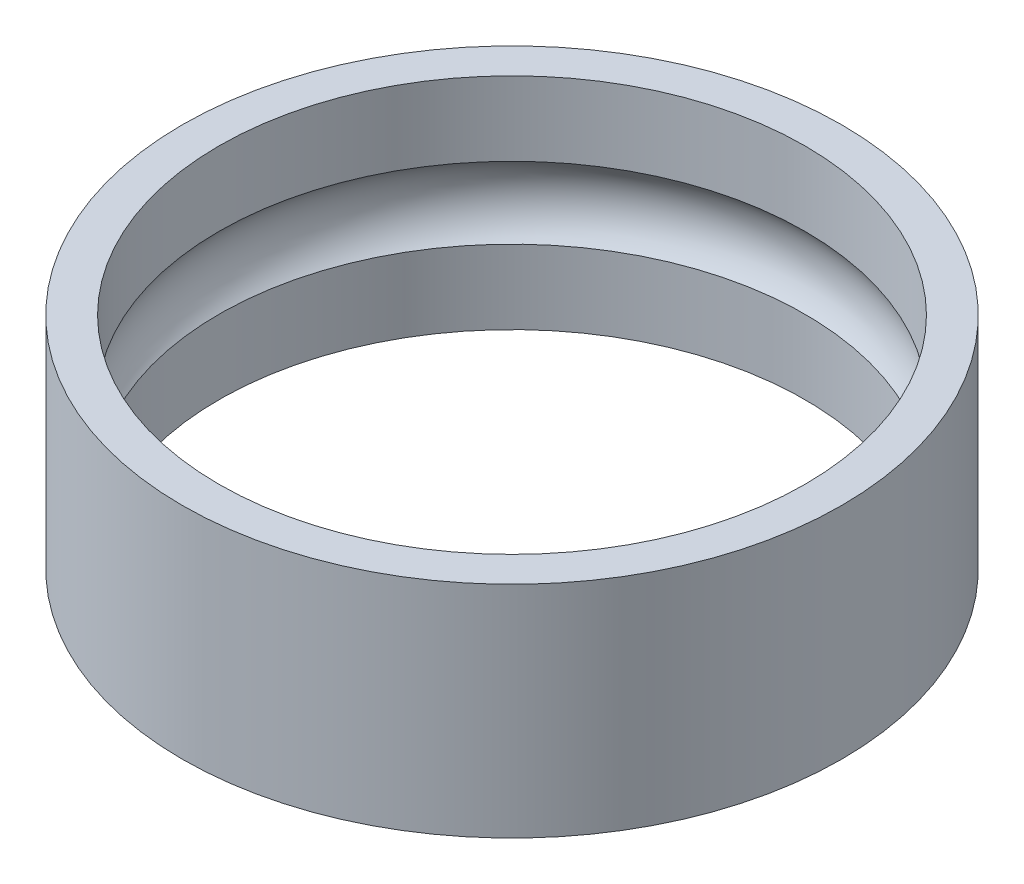
ISO-10303-21;
HEADER;
FILE_DESCRIPTION(('STEP AP214'),'2;1');
FILE_NAME('part.step','',(''),(''),'','','');
FILE_SCHEMA(('AUTOMOTIVE_DESIGN { 1 0 10303 214 1 1 1 1 }'));
ENDSEC;
DATA;
#1=APPLICATION_CONTEXT('core data for automotive mechanical design processes');
#2=APPLICATION_PROTOCOL_DEFINITION('international standard','automotive_design',2000,#1);
#3=PRODUCT_CONTEXT('',#1,'mechanical');
#4=PRODUCT('Part','Part','',(#3));
#5=PRODUCT_RELATED_PRODUCT_CATEGORY('part','',(#4));
#6=PRODUCT_DEFINITION_FORMATION('','',#4);
#7=PRODUCT_DEFINITION_CONTEXT('part definition',#1,'design');
#8=PRODUCT_DEFINITION('design','',#6,#7);
#9=PRODUCT_DEFINITION_SHAPE('','',#8);
#10=(LENGTH_UNIT() NAMED_UNIT(*) SI_UNIT(.MILLI.,.METRE.));
#11=(NAMED_UNIT(*) PLANE_ANGLE_UNIT() SI_UNIT($,.RADIAN.));
#12=(NAMED_UNIT(*) SI_UNIT($,.STERADIAN.) SOLID_ANGLE_UNIT());
#13=UNCERTAINTY_MEASURE_WITH_UNIT(LENGTH_MEASURE(1.E-05),#10,'distance_accuracy_value','');
#14=(GEOMETRIC_REPRESENTATION_CONTEXT(3) GLOBAL_UNCERTAINTY_ASSIGNED_CONTEXT((#13)) GLOBAL_UNIT_ASSIGNED_CONTEXT((#10,
#11,#12)) REPRESENTATION_CONTEXT('',''));
#15=CARTESIAN_POINT('',(0.,0.,0.));
#16=DIRECTION('',(0.,0.,1.));
#17=DIRECTION('',(1.,0.,0.));
#18=AXIS2_PLACEMENT_3D('',#15,#16,#17);
#19=CARTESIAN_POINT('',(0.,1.5,0.));
#20=DIRECTION('',(0.,-1.,0.));
#21=DIRECTION('',(0.,0.,-1.));
#22=AXIS2_PLACEMENT_3D('',#19,#20,#21);
#23=CYLINDRICAL_SURFACE('',#22,4.);
#24=CARTESIAN_POINT('',(0.,1.5,0.));
#25=DIRECTION('',(0.,1.,0.));
#26=DIRECTION('',(0.,0.,1.));
#27=AXIS2_PLACEMENT_3D('',#24,#25,#26);
#28=CIRCLE('',#27,4.);
#29=CARTESIAN_POINT('',(0.,1.5,4.));
#30=VERTEX_POINT('',#29);
#31=EDGE_CURVE('E45',#30,#30,#28,.T.);
#32=ORIENTED_EDGE('',*,*,#31,.T.);
#33=EDGE_LOOP('',(#32));
#34=FACE_BOUND('',#33,.T.);
#35=CARTESIAN_POINT('',(0.,0.489897948556634,0.));
#36=DIRECTION('',(0.,-1.,0.));
#37=DIRECTION('',(0.,0.,-1.));
#38=AXIS2_PLACEMENT_3D('',#35,#36,#37);
#39=CIRCLE('',#38,4.);
#40=CARTESIAN_POINT('',(0.,0.489897948556634,-4.));
#41=VERTEX_POINT('',#40);
#42=EDGE_CURVE('E36',#41,#41,#39,.T.);
#43=ORIENTED_EDGE('',*,*,#42,.T.);
#44=EDGE_LOOP('',(#43));
#45=FACE_BOUND('',#44,.T.);
#46=ADVANCED_FACE('F32',(#34,#45),#23,.F.);
#47=CARTESIAN_POINT('',(0.,-1.5,0.));
#48=DIRECTION('',(0.,1.,0.));
#49=DIRECTION('',(0.,0.,1.));
#50=AXIS2_PLACEMENT_3D('',#47,#48,#49);
#51=CIRCLE('',#50,4.);
#52=CARTESIAN_POINT('',(0.,-1.5,4.));
#53=VERTEX_POINT('',#52);
#54=EDGE_CURVE('E48',#53,#53,#51,.T.);
#55=ORIENTED_EDGE('',*,*,#54,.F.);
#56=EDGE_LOOP('',(#55));
#57=FACE_BOUND('',#56,.T.);
#58=CARTESIAN_POINT('',(0.,-0.489897948556634,0.));
#59=DIRECTION('',(0.,1.,0.));
#60=DIRECTION('',(0.,0.,1.));
#61=AXIS2_PLACEMENT_3D('',#58,#59,#60);
#62=CIRCLE('',#61,4.);
#63=CARTESIAN_POINT('',(0.,-0.489897948556634,4.));
#64=VERTEX_POINT('',#63);
#65=EDGE_CURVE('E50',#64,#64,#62,.T.);
#66=ORIENTED_EDGE('',*,*,#65,.T.);
#67=EDGE_LOOP('',(#66));
#68=FACE_BOUND('',#67,.T.);
#69=ADVANCED_FACE('F67',(#57,#68),#23,.F.);
#70=CARTESIAN_POINT('',(0.,1.5,0.));
#71=DIRECTION('',(0.,1.,0.));
#72=DIRECTION('',(0.,0.,1.));
#73=AXIS2_PLACEMENT_3D('',#70,#71,#72);
#74=PLANE('',#73);
#75=CARTESIAN_POINT('',(0.,1.5,0.));
#76=DIRECTION('',(0.,1.,0.));
#77=DIRECTION('',(0.,0.,1.));
#78=AXIS2_PLACEMENT_3D('',#75,#76,#77);
#79=CIRCLE('',#78,4.5);
#80=CARTESIAN_POINT('',(0.,1.5,4.5));
#81=VERTEX_POINT('',#80);
#82=EDGE_CURVE('E10',#81,#81,#79,.T.);
#83=ORIENTED_EDGE('',*,*,#82,.T.);
#84=EDGE_LOOP('',(#83));
#85=FACE_BOUND('',#84,.T.);
#86=ORIENTED_EDGE('',*,*,#31,.F.);
#87=EDGE_LOOP('',(#86));
#88=FACE_BOUND('',#87,.T.);
#89=ADVANCED_FACE('F64',(#85,#88),#74,.T.);
#90=CARTESIAN_POINT('',(0.,-1.5,0.));
#91=DIRECTION('',(0.,1.,0.));
#92=DIRECTION('',(0.,0.,1.));
#93=AXIS2_PLACEMENT_3D('',#90,#91,#92);
#94=PLANE('',#93);
#95=CARTESIAN_POINT('',(0.,-1.5,0.));
#96=DIRECTION('',(0.,1.,0.));
#97=DIRECTION('',(0.,0.,1.));
#98=AXIS2_PLACEMENT_3D('',#95,#96,#97);
#99=CIRCLE('',#98,4.5);
#100=CARTESIAN_POINT('',(0.,-1.5,4.5));
#101=VERTEX_POINT('',#100);
#102=EDGE_CURVE('E40',#101,#101,#99,.T.);
#103=ORIENTED_EDGE('',*,*,#102,.F.);
#104=EDGE_LOOP('',(#103));
#105=FACE_BOUND('',#104,.T.);
#106=ORIENTED_EDGE('',*,*,#54,.T.);
#107=EDGE_LOOP('',(#106));
#108=FACE_BOUND('',#107,.T.);
#109=ADVANCED_FACE('F66',(#105,#108),#94,.F.);
#110=CARTESIAN_POINT('',(0.,1.5,0.));
#111=DIRECTION('',(0.,-1.,0.));
#112=DIRECTION('',(0.,0.,-1.));
#113=AXIS2_PLACEMENT_3D('',#110,#111,#112);
#114=CYLINDRICAL_SURFACE('',#113,4.5);
#115=ORIENTED_EDGE('',*,*,#82,.F.);
#116=EDGE_LOOP('',(#115));
#117=FACE_BOUND('',#116,.T.);
#118=ORIENTED_EDGE('',*,*,#102,.T.);
#119=EDGE_LOOP('',(#118));
#120=FACE_BOUND('',#119,.T.);
#121=ADVANCED_FACE('F34',(#117,#120),#114,.T.);
#122=CARTESIAN_POINT('',(0.,0.,0.));
#123=DIRECTION('',(0.,1.,0.));
#124=DIRECTION('',(0.,0.,1.));
#125=AXIS2_PLACEMENT_3D('',#122,#123,#124);
#126=TOROIDAL_SURFACE('',#125,3.5,0.699999999999999);
#127=ORIENTED_EDGE('',*,*,#42,.F.);
#128=EDGE_LOOP('',(#127));
#129=FACE_BOUND('',#128,.T.);
#130=ORIENTED_EDGE('',*,*,#65,.F.);
#131=EDGE_LOOP('',(#130));
#132=FACE_BOUND('',#131,.T.);
#133=ADVANCED_FACE('F80',(#129,#132),#126,.F.);
#134=CLOSED_SHELL('',(#46,#69,#89,#109,#121,#133));
#135=MANIFOLD_SOLID_BREP('B2',#134);
#136=ADVANCED_BREP_SHAPE_REPRESENTATION('',(#18,#135),#14);
#137=SHAPE_DEFINITION_REPRESENTATION(#9,#136);
ENDSEC;
END-ISO-10303-21;
